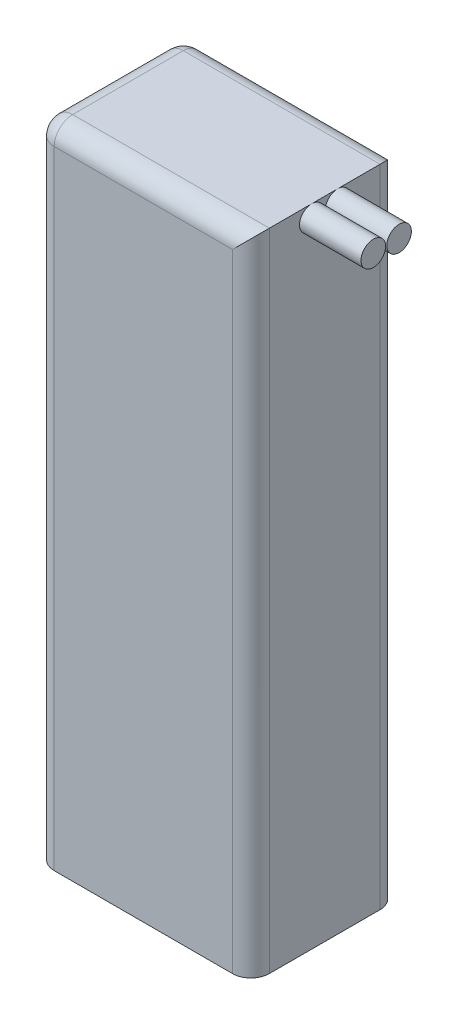
ISO-10303-21;
HEADER;
FILE_DESCRIPTION(('STEP AP214'),'2;1');
FILE_NAME('part.step','',(''),(''),'','','');
FILE_SCHEMA(('AUTOMOTIVE_DESIGN { 1 0 10303 214 1 1 1 1 }'));
ENDSEC;
DATA;
#1=APPLICATION_CONTEXT('core data for automotive mechanical design processes');
#2=APPLICATION_PROTOCOL_DEFINITION('international standard','automotive_design',2000,#1);
#3=PRODUCT_CONTEXT('',#1,'mechanical');
#4=PRODUCT('Part','Part','',(#3));
#5=PRODUCT_RELATED_PRODUCT_CATEGORY('part','',(#4));
#6=PRODUCT_DEFINITION_FORMATION('','',#4);
#7=PRODUCT_DEFINITION_CONTEXT('part definition',#1,'design');
#8=PRODUCT_DEFINITION('design','',#6,#7);
#9=PRODUCT_DEFINITION_SHAPE('','',#8);
#10=(LENGTH_UNIT() NAMED_UNIT(*) SI_UNIT(.MILLI.,.METRE.));
#11=(NAMED_UNIT(*) PLANE_ANGLE_UNIT() SI_UNIT($,.RADIAN.));
#12=(NAMED_UNIT(*) SI_UNIT($,.STERADIAN.) SOLID_ANGLE_UNIT());
#13=UNCERTAINTY_MEASURE_WITH_UNIT(LENGTH_MEASURE(1.E-05),#10,'distance_accuracy_value','');
#14=(GEOMETRIC_REPRESENTATION_CONTEXT(3) GLOBAL_UNCERTAINTY_ASSIGNED_CONTEXT((#13)) GLOBAL_UNIT_ASSIGNED_CONTEXT((#10,
#11,#12)) REPRESENTATION_CONTEXT('',''));
#15=CARTESIAN_POINT('',(0.,0.,0.));
#16=DIRECTION('',(0.,0.,1.));
#17=DIRECTION('',(1.,0.,0.));
#18=AXIS2_PLACEMENT_3D('',#15,#16,#17);
#19=CARTESIAN_POINT('',(0.,105.,0.));
#20=DIRECTION('',(1.,0.,0.));
#21=DIRECTION('',(0.,0.,-1.));
#22=AXIS2_PLACEMENT_3D('',#19,#20,#21);
#23=PLANE('',#22);
#24=DIRECTION('',(0.,0.,1.));
#25=VECTOR('',#24,1.);
#26=CARTESIAN_POINT('',(0.,102.,0.));
#27=LINE('',#26,#25);
#28=CARTESIAN_POINT('',(0.,102.,-3.));
#29=VERTEX_POINT('',#28);
#30=CARTESIAN_POINT('',(0.,102.,-21.));
#31=VERTEX_POINT('',#30);
#32=EDGE_CURVE('E161',#29,#31,#27,.F.);
#33=ORIENTED_EDGE('',*,*,#32,.T.);
#34=DIRECTION('',(0.,-1.,0.));
#35=VECTOR('',#34,1.);
#36=CARTESIAN_POINT('',(0.,105.,-21.));
#37=LINE('',#36,#35);
#38=CARTESIAN_POINT('',(0.,0.,-21.));
#39=VERTEX_POINT('',#38);
#40=EDGE_CURVE('E163',#31,#39,#37,.T.);
#41=ORIENTED_EDGE('',*,*,#40,.T.);
#42=DIRECTION('',(0.,0.,1.));
#43=VECTOR('',#42,1.);
#44=CARTESIAN_POINT('',(0.,0.,0.));
#45=LINE('',#44,#43);
#46=CARTESIAN_POINT('',(0.,0.,-3.));
#47=VERTEX_POINT('',#46);
#48=EDGE_CURVE('E217',#39,#47,#45,.T.);
#49=ORIENTED_EDGE('',*,*,#48,.T.);
#50=DIRECTION('',(0.,-1.,0.));
#51=VECTOR('',#50,1.);
#52=CARTESIAN_POINT('',(0.,105.,-3.));
#53=LINE('',#52,#51);
#54=EDGE_CURVE('E159',#47,#29,#53,.F.);
#55=ORIENTED_EDGE('',*,*,#54,.T.);
#56=EDGE_LOOP('',(#33,#41,#49,#55));
#57=FACE_BOUND('',#56,.T.);
#58=ADVANCED_FACE('F49',(#57),#23,.F.);
#59=CARTESIAN_POINT('',(0.,105.,0.));
#60=DIRECTION('',(0.,0.,-1.));
#61=DIRECTION('',(-1.,0.,0.));
#62=AXIS2_PLACEMENT_3D('',#59,#60,#61);
#63=PLANE('',#62);
#64=DIRECTION('',(1.,0.,0.));
#65=VECTOR('',#64,1.);
#66=CARTESIAN_POINT('',(0.,102.,0.));
#67=LINE('',#66,#65);
#68=CARTESIAN_POINT('',(32.,102.,0.));
#69=VERTEX_POINT('',#68);
#70=CARTESIAN_POINT('',(3.,102.,0.));
#71=VERTEX_POINT('',#70);
#72=EDGE_CURVE('E65',#69,#71,#67,.F.);
#73=ORIENTED_EDGE('',*,*,#72,.T.);
#74=DIRECTION('',(0.,-1.,0.));
#75=VECTOR('',#74,1.);
#76=CARTESIAN_POINT('',(3.,105.,0.));
#77=LINE('',#76,#75);
#78=CARTESIAN_POINT('',(3.,0.,0.));
#79=VERTEX_POINT('',#78);
#80=EDGE_CURVE('E11',#71,#79,#77,.T.);
#81=ORIENTED_EDGE('',*,*,#80,.T.);
#82=DIRECTION('',(1.,0.,0.));
#83=VECTOR('',#82,1.);
#84=CARTESIAN_POINT('',(0.,0.,0.));
#85=LINE('',#84,#83);
#86=CARTESIAN_POINT('',(32.,0.,0.));
#87=VERTEX_POINT('',#86);
#88=EDGE_CURVE('E230',#79,#87,#85,.T.);
#89=ORIENTED_EDGE('',*,*,#88,.T.);
#90=DIRECTION('',(0.,-1.,0.));
#91=VECTOR('',#90,1.);
#92=CARTESIAN_POINT('',(32.,105.,0.));
#93=LINE('',#92,#91);
#94=EDGE_CURVE('E58',#87,#69,#93,.F.);
#95=ORIENTED_EDGE('',*,*,#94,.T.);
#96=EDGE_LOOP('',(#73,#81,#89,#95));
#97=FACE_BOUND('',#96,.T.);
#98=ADVANCED_FACE('F232',(#97),#63,.F.);
#99=CARTESIAN_POINT('',(35.,105.,0.));
#100=DIRECTION('',(-1.,0.,0.));
#101=DIRECTION('',(0.,0.,1.));
#102=AXIS2_PLACEMENT_3D('',#99,#100,#101);
#103=PLANE('',#102);
#104=DIRECTION('',(0.,0.,-1.));
#105=VECTOR('',#104,1.);
#106=CARTESIAN_POINT('',(35.,0.,0.));
#107=LINE('',#106,#105);
#108=CARTESIAN_POINT('',(35.,0.,-3.));
#109=VERTEX_POINT('',#108);
#110=CARTESIAN_POINT('',(35.,0.,-21.));
#111=VERTEX_POINT('',#110);
#112=EDGE_CURVE('E145',#109,#111,#107,.T.);
#113=ORIENTED_EDGE('',*,*,#112,.T.);
#114=DIRECTION('',(0.,-1.,0.));
#115=VECTOR('',#114,1.);
#116=CARTESIAN_POINT('',(35.,105.,-21.));
#117=LINE('',#116,#115);
#118=CARTESIAN_POINT('',(35.,105.,-21.));
#119=VERTEX_POINT('',#118);
#120=EDGE_CURVE('E142',#111,#119,#117,.F.);
#121=ORIENTED_EDGE('',*,*,#120,.T.);
#122=DIRECTION('',(0.,0.,-1.));
#123=VECTOR('',#122,1.);
#124=CARTESIAN_POINT('',(35.,105.,0.));
#125=LINE('',#124,#123);
#126=CARTESIAN_POINT('',(35.,105.,-14.1));
#127=VERTEX_POINT('',#126);
#128=EDGE_CURVE('E129',#127,#119,#125,.T.);
#129=ORIENTED_EDGE('',*,*,#128,.F.);
#130=CARTESIAN_POINT('',(35.,103.,-14.1));
#131=DIRECTION('',(1.,0.,0.));
#132=DIRECTION('',(0.,0.,-1.));
#133=AXIS2_PLACEMENT_3D('',#130,#131,#132);
#134=CIRCLE('',#133,2.00000000000001);
#135=EDGE_CURVE('E140',#127,#127,#134,.T.);
#136=ORIENTED_EDGE('',*,*,#135,.F.);
#137=CARTESIAN_POINT('',(35.,105.,-9.9));
#138=VERTEX_POINT('',#137);
#139=EDGE_CURVE('E126',#138,#127,#125,.T.);
#140=ORIENTED_EDGE('',*,*,#139,.F.);
#141=CARTESIAN_POINT('',(35.,103.,-9.9));
#142=DIRECTION('',(1.,0.,0.));
#143=DIRECTION('',(0.,0.,-1.));
#144=AXIS2_PLACEMENT_3D('',#141,#142,#143);
#145=CIRCLE('',#144,2.);
#146=EDGE_CURVE('E212',#138,#138,#145,.T.);
#147=ORIENTED_EDGE('',*,*,#146,.F.);
#148=CARTESIAN_POINT('',(35.,105.,-3.));
#149=VERTEX_POINT('',#148);
#150=EDGE_CURVE('E132',#149,#138,#125,.T.);
#151=ORIENTED_EDGE('',*,*,#150,.F.);
#152=DIRECTION('',(0.,-1.,0.));
#153=VECTOR('',#152,1.);
#154=CARTESIAN_POINT('',(35.,105.,-3.));
#155=LINE('',#154,#153);
#156=EDGE_CURVE('E179',#149,#109,#155,.T.);
#157=ORIENTED_EDGE('',*,*,#156,.T.);
#158=EDGE_LOOP('',(#113,#121,#129,#136,#140,#147,#151,#157));
#159=FACE_BOUND('',#158,.T.);
#160=ADVANCED_FACE('F138',(#159),#103,.F.);
#161=CARTESIAN_POINT('',(0.,105.,-24.));
#162=DIRECTION('',(0.,0.,1.));
#163=DIRECTION('',(1.,0.,0.));
#164=AXIS2_PLACEMENT_3D('',#161,#162,#163);
#165=PLANE('',#164);
#166=DIRECTION('',(-1.,0.,0.));
#167=VECTOR('',#166,1.);
#168=CARTESIAN_POINT('',(0.,0.,-24.));
#169=LINE('',#168,#167);
#170=CARTESIAN_POINT('',(32.,0.,-24.));
#171=VERTEX_POINT('',#170);
#172=CARTESIAN_POINT('',(3.00000000000001,0.,-24.));
#173=VERTEX_POINT('',#172);
#174=EDGE_CURVE('E143',#171,#173,#169,.T.);
#175=ORIENTED_EDGE('',*,*,#174,.T.);
#176=DIRECTION('',(0.,-1.,0.));
#177=VECTOR('',#176,1.);
#178=CARTESIAN_POINT('',(3.00000000000001,105.,-24.));
#179=LINE('',#178,#177);
#180=CARTESIAN_POINT('',(3.00000000000001,102.,-24.));
#181=VERTEX_POINT('',#180);
#182=EDGE_CURVE('E169',#173,#181,#179,.F.);
#183=ORIENTED_EDGE('',*,*,#182,.T.);
#184=DIRECTION('',(-1.,0.,0.));
#185=VECTOR('',#184,1.);
#186=CARTESIAN_POINT('',(0.,102.,-24.));
#187=LINE('',#186,#185);
#188=CARTESIAN_POINT('',(32.,102.,-24.));
#189=VERTEX_POINT('',#188);
#190=EDGE_CURVE('E167',#181,#189,#187,.F.);
#191=ORIENTED_EDGE('',*,*,#190,.T.);
#192=DIRECTION('',(0.,-1.,0.));
#193=VECTOR('',#192,1.);
#194=CARTESIAN_POINT('',(32.,105.,-24.));
#195=LINE('',#194,#193);
#196=EDGE_CURVE('E165',#189,#171,#195,.T.);
#197=ORIENTED_EDGE('',*,*,#196,.T.);
#198=EDGE_LOOP('',(#175,#183,#191,#197));
#199=FACE_BOUND('',#198,.T.);
#200=ADVANCED_FACE('F263',(#199),#165,.F.);
#201=CARTESIAN_POINT('',(0.,105.,0.));
#202=DIRECTION('',(0.,-1.,0.));
#203=DIRECTION('',(0.,0.,-1.));
#204=AXIS2_PLACEMENT_3D('',#201,#202,#203);
#205=PLANE('',#204);
#206=ORIENTED_EDGE('',*,*,#128,.T.);
#207=DIRECTION('',(-1.,0.,0.));
#208=VECTOR('',#207,1.);
#209=CARTESIAN_POINT('',(0.,105.,-21.));
#210=LINE('',#209,#208);
#211=CARTESIAN_POINT('',(3.00000000000001,105.,-21.));
#212=VERTEX_POINT('',#211);
#213=EDGE_CURVE('E154',#119,#212,#210,.T.);
#214=ORIENTED_EDGE('',*,*,#213,.T.);
#215=DIRECTION('',(0.,0.,1.));
#216=VECTOR('',#215,1.);
#217=CARTESIAN_POINT('',(3.,105.,0.));
#218=LINE('',#217,#216);
#219=CARTESIAN_POINT('',(3.,105.,-3.));
#220=VERTEX_POINT('',#219);
#221=EDGE_CURVE('E150',#212,#220,#218,.T.);
#222=ORIENTED_EDGE('',*,*,#221,.T.);
#223=DIRECTION('',(1.,0.,0.));
#224=VECTOR('',#223,1.);
#225=CARTESIAN_POINT('',(0.,105.,-3.));
#226=LINE('',#225,#224);
#227=EDGE_CURVE('E149',#220,#149,#226,.T.);
#228=ORIENTED_EDGE('',*,*,#227,.T.);
#229=ORIENTED_EDGE('',*,*,#150,.T.);
#230=ORIENTED_EDGE('',*,*,#139,.T.);
#231=EDGE_LOOP('',(#206,#214,#222,#228,#229,#230));
#232=FACE_BOUND('',#231,.T.);
#233=ADVANCED_FACE('F128',(#232),#205,.F.);
#234=CARTESIAN_POINT('',(0.,0.,0.));
#235=DIRECTION('',(0.,-1.,0.));
#236=DIRECTION('',(0.,0.,-1.));
#237=AXIS2_PLACEMENT_3D('',#234,#235,#236);
#238=PLANE('',#237);
#239=ORIENTED_EDGE('',*,*,#48,.F.);
#240=CARTESIAN_POINT('',(3.00000000000001,0.,-21.));
#241=DIRECTION('',(0.,-1.,0.));
#242=DIRECTION('',(0.,0.,-1.));
#243=AXIS2_PLACEMENT_3D('',#240,#241,#242);
#244=CIRCLE('',#243,3.);
#245=EDGE_CURVE('E177',#39,#173,#244,.T.);
#246=ORIENTED_EDGE('',*,*,#245,.T.);
#247=ORIENTED_EDGE('',*,*,#174,.F.);
#248=CARTESIAN_POINT('',(32.,0.,-21.));
#249=DIRECTION('',(0.,-1.,0.));
#250=DIRECTION('',(0.,0.,-1.));
#251=AXIS2_PLACEMENT_3D('',#248,#249,#250);
#252=CIRCLE('',#251,3.);
#253=EDGE_CURVE('E175',#171,#111,#252,.T.);
#254=ORIENTED_EDGE('',*,*,#253,.T.);
#255=ORIENTED_EDGE('',*,*,#112,.F.);
#256=CARTESIAN_POINT('',(32.,0.,-3.));
#257=DIRECTION('',(0.,-1.,0.));
#258=DIRECTION('',(0.,0.,-1.));
#259=AXIS2_PLACEMENT_3D('',#256,#257,#258);
#260=CIRCLE('',#259,3.);
#261=EDGE_CURVE('E171',#109,#87,#260,.T.);
#262=ORIENTED_EDGE('',*,*,#261,.T.);
#263=ORIENTED_EDGE('',*,*,#88,.F.);
#264=CARTESIAN_POINT('',(3.,0.,-3.));
#265=DIRECTION('',(0.,-1.,0.));
#266=DIRECTION('',(0.,0.,-1.));
#267=AXIS2_PLACEMENT_3D('',#264,#265,#266);
#268=CIRCLE('',#267,3.);
#269=EDGE_CURVE('E173',#79,#47,#268,.T.);
#270=ORIENTED_EDGE('',*,*,#269,.T.);
#271=EDGE_LOOP('',(#239,#246,#247,#254,#255,#262,#263,#270));
#272=FACE_BOUND('',#271,.T.);
#273=ADVANCED_FACE('F229',(#272),#238,.T.);
#274=CARTESIAN_POINT('',(45.,103.,-9.90000000000001));
#275=DIRECTION('',(-1.,0.,0.));
#276=DIRECTION('',(0.,0.,1.));
#277=AXIS2_PLACEMENT_3D('',#274,#275,#276);
#278=CYLINDRICAL_SURFACE('',#277,2.);
#279=CARTESIAN_POINT('',(45.,103.,-9.90000000000001));
#280=DIRECTION('',(1.,0.,0.));
#281=DIRECTION('',(0.,0.,-1.));
#282=AXIS2_PLACEMENT_3D('',#279,#280,#281);
#283=CIRCLE('',#282,2.);
#284=CARTESIAN_POINT('',(45.,103.,-11.9));
#285=VERTEX_POINT('',#284);
#286=EDGE_CURVE('E215',#285,#285,#283,.T.);
#287=ORIENTED_EDGE('',*,*,#286,.F.);
#288=EDGE_LOOP('',(#287));
#289=FACE_BOUND('',#288,.T.);
#290=ORIENTED_EDGE('',*,*,#146,.T.);
#291=EDGE_LOOP('',(#290));
#292=FACE_BOUND('',#291,.T.);
#293=ADVANCED_FACE('F220',(#289,#292),#278,.T.);
#294=CARTESIAN_POINT('',(45.,103.,-9.90000000000001));
#295=DIRECTION('',(1.,0.,0.));
#296=DIRECTION('',(0.,0.,-1.));
#297=AXIS2_PLACEMENT_3D('',#294,#295,#296);
#298=PLANE('',#297);
#299=ORIENTED_EDGE('',*,*,#286,.T.);
#300=EDGE_LOOP('',(#299));
#301=FACE_BOUND('',#300,.T.);
#302=ADVANCED_FACE('F359',(#301),#298,.T.);
#303=CARTESIAN_POINT('',(45.,103.,-14.1));
#304=DIRECTION('',(-1.,0.,0.));
#305=DIRECTION('',(0.,0.,1.));
#306=AXIS2_PLACEMENT_3D('',#303,#304,#305);
#307=CYLINDRICAL_SURFACE('',#306,2.00000000000001);
#308=CARTESIAN_POINT('',(45.,103.,-14.1));
#309=DIRECTION('',(1.,0.,0.));
#310=DIRECTION('',(0.,0.,-1.));
#311=AXIS2_PLACEMENT_3D('',#308,#309,#310);
#312=CIRCLE('',#311,2.00000000000001);
#313=CARTESIAN_POINT('',(45.,103.,-16.1));
#314=VERTEX_POINT('',#313);
#315=EDGE_CURVE('E204',#314,#314,#312,.T.);
#316=ORIENTED_EDGE('',*,*,#315,.F.);
#317=EDGE_LOOP('',(#316));
#318=FACE_BOUND('',#317,.T.);
#319=ORIENTED_EDGE('',*,*,#135,.T.);
#320=EDGE_LOOP('',(#319));
#321=FACE_BOUND('',#320,.T.);
#322=ADVANCED_FACE('F273',(#318,#321),#307,.T.);
#323=CARTESIAN_POINT('',(45.,103.,-14.1));
#324=DIRECTION('',(1.,0.,0.));
#325=DIRECTION('',(0.,0.,-1.));
#326=AXIS2_PLACEMENT_3D('',#323,#324,#325);
#327=PLANE('',#326);
#328=ORIENTED_EDGE('',*,*,#315,.T.);
#329=EDGE_LOOP('',(#328));
#330=FACE_BOUND('',#329,.T.);
#331=ADVANCED_FACE('F267',(#330),#327,.T.);
#332=CARTESIAN_POINT('',(32.,105.,-21.));
#333=DIRECTION('',(0.,-1.,0.));
#334=DIRECTION('',(0.,0.,-1.));
#335=AXIS2_PLACEMENT_3D('',#332,#333,#334);
#336=CYLINDRICAL_SURFACE('',#335,3.);
#337=ORIENTED_EDGE('',*,*,#253,.F.);
#338=ORIENTED_EDGE('',*,*,#196,.F.);
#339=CARTESIAN_POINT('',(32.,102.,-21.));
#340=DIRECTION('',(0.707106781186547,-0.707106781186547,0.));
#341=DIRECTION('',(-0.707106781186547,-0.707106781186547,0.));
#342=AXIS2_PLACEMENT_3D('',#339,#340,#341);
#343=ELLIPSE('',#342,4.24264068711928,3.);
#344=EDGE_CURVE('E53',#119,#189,#343,.F.);
#345=ORIENTED_EDGE('',*,*,#344,.F.);
#346=ORIENTED_EDGE('',*,*,#120,.F.);
#347=EDGE_LOOP('',(#337,#338,#345,#346));
#348=FACE_BOUND('',#347,.T.);
#349=ADVANCED_FACE('F51',(#348),#336,.T.);
#350=CARTESIAN_POINT('',(32.,105.,-3.));
#351=DIRECTION('',(0.,-1.,0.));
#352=DIRECTION('',(0.,0.,-1.));
#353=AXIS2_PLACEMENT_3D('',#350,#351,#352);
#354=CYLINDRICAL_SURFACE('',#353,3.);
#355=ORIENTED_EDGE('',*,*,#261,.F.);
#356=ORIENTED_EDGE('',*,*,#156,.F.);
#357=CARTESIAN_POINT('',(32.,102.,-3.));
#358=DIRECTION('',(0.707106781186547,-0.707106781186547,0.));
#359=DIRECTION('',(0.707106781186547,0.707106781186547,0.));
#360=AXIS2_PLACEMENT_3D('',#357,#358,#359);
#361=ELLIPSE('',#360,4.24264068711928,3.);
#362=EDGE_CURVE('E200',#69,#149,#361,.F.);
#363=ORIENTED_EDGE('',*,*,#362,.F.);
#364=ORIENTED_EDGE('',*,*,#94,.F.);
#365=EDGE_LOOP('',(#355,#356,#363,#364));
#366=FACE_BOUND('',#365,.T.);
#367=ADVANCED_FACE('F225',(#366),#354,.T.);
#368=CARTESIAN_POINT('',(3.00000000000001,105.,-21.));
#369=DIRECTION('',(0.,-1.,0.));
#370=DIRECTION('',(0.,0.,-1.));
#371=AXIS2_PLACEMENT_3D('',#368,#369,#370);
#372=CYLINDRICAL_SURFACE('',#371,3.);
#373=ORIENTED_EDGE('',*,*,#245,.F.);
#374=ORIENTED_EDGE('',*,*,#40,.F.);
#375=CARTESIAN_POINT('',(3.00000000000001,102.,-21.));
#376=DIRECTION('',(0.,1.,0.));
#377=DIRECTION('',(0.,0.,1.));
#378=AXIS2_PLACEMENT_3D('',#375,#376,#377);
#379=CIRCLE('',#378,3.);
#380=EDGE_CURVE('E198',#181,#31,#379,.T.);
#381=ORIENTED_EDGE('',*,*,#380,.F.);
#382=ORIENTED_EDGE('',*,*,#182,.F.);
#383=EDGE_LOOP('',(#373,#374,#381,#382));
#384=FACE_BOUND('',#383,.T.);
#385=ADVANCED_FACE('F259',(#384),#372,.T.);
#386=CARTESIAN_POINT('',(0.,102.,-21.));
#387=DIRECTION('',(-1.,0.,0.));
#388=DIRECTION('',(0.,0.,1.));
#389=AXIS2_PLACEMENT_3D('',#386,#387,#388);
#390=CYLINDRICAL_SURFACE('',#389,3.);
#391=ORIENTED_EDGE('',*,*,#344,.T.);
#392=ORIENTED_EDGE('',*,*,#190,.F.);
#393=CARTESIAN_POINT('',(3.00000000000001,102.,-21.));
#394=DIRECTION('',(-1.,0.,0.));
#395=DIRECTION('',(0.,0.,1.));
#396=AXIS2_PLACEMENT_3D('',#393,#394,#395);
#397=CIRCLE('',#396,3.);
#398=EDGE_CURVE('E195',#212,#181,#397,.T.);
#399=ORIENTED_EDGE('',*,*,#398,.F.);
#400=ORIENTED_EDGE('',*,*,#213,.F.);
#401=EDGE_LOOP('',(#391,#392,#399,#400));
#402=FACE_BOUND('',#401,.T.);
#403=ADVANCED_FACE('F253',(#402),#390,.T.);
#404=CARTESIAN_POINT('',(0.,102.,-3.));
#405=DIRECTION('',(1.,0.,0.));
#406=DIRECTION('',(0.,0.,-1.));
#407=AXIS2_PLACEMENT_3D('',#404,#405,#406);
#408=CYLINDRICAL_SURFACE('',#407,3.);
#409=ORIENTED_EDGE('',*,*,#362,.T.);
#410=ORIENTED_EDGE('',*,*,#227,.F.);
#411=CARTESIAN_POINT('',(3.,102.,-3.));
#412=DIRECTION('',(-1.,0.,0.));
#413=DIRECTION('',(0.,0.,1.));
#414=AXIS2_PLACEMENT_3D('',#411,#412,#413);
#415=CIRCLE('',#414,3.);
#416=EDGE_CURVE('E192',#71,#220,#415,.T.);
#417=ORIENTED_EDGE('',*,*,#416,.F.);
#418=ORIENTED_EDGE('',*,*,#72,.F.);
#419=EDGE_LOOP('',(#409,#410,#417,#418));
#420=FACE_BOUND('',#419,.T.);
#421=ADVANCED_FACE('F251',(#420),#408,.T.);
#422=CARTESIAN_POINT('',(3.,105.,-3.));
#423=DIRECTION('',(0.,-1.,0.));
#424=DIRECTION('',(0.,0.,-1.));
#425=AXIS2_PLACEMENT_3D('',#422,#423,#424);
#426=CYLINDRICAL_SURFACE('',#425,3.);
#427=ORIENTED_EDGE('',*,*,#269,.F.);
#428=ORIENTED_EDGE('',*,*,#80,.F.);
#429=CARTESIAN_POINT('',(3.,102.,-3.));
#430=DIRECTION('',(0.,1.,0.));
#431=DIRECTION('',(0.,0.,1.));
#432=AXIS2_PLACEMENT_3D('',#429,#430,#431);
#433=CIRCLE('',#432,3.);
#434=EDGE_CURVE('E189',#29,#71,#433,.T.);
#435=ORIENTED_EDGE('',*,*,#434,.F.);
#436=ORIENTED_EDGE('',*,*,#54,.F.);
#437=EDGE_LOOP('',(#427,#428,#435,#436));
#438=FACE_BOUND('',#437,.T.);
#439=ADVANCED_FACE('F241',(#438),#426,.T.);
#440=CARTESIAN_POINT('',(3.00000000000001,102.,-21.));
#441=DIRECTION('',(0.,0.,-1.));
#442=DIRECTION('',(-1.,0.,0.));
#443=AXIS2_PLACEMENT_3D('',#440,#441,#442);
#444=SPHERICAL_SURFACE('',#443,3.);
#445=ORIENTED_EDGE('',*,*,#398,.T.);
#446=ORIENTED_EDGE('',*,*,#380,.T.);
#447=CARTESIAN_POINT('',(3.00000000000001,102.,-21.));
#448=DIRECTION('',(0.,0.,-1.));
#449=DIRECTION('',(-1.,0.,0.));
#450=AXIS2_PLACEMENT_3D('',#447,#448,#449);
#451=CIRCLE('',#450,3.);
#452=EDGE_CURVE('E186',#212,#31,#451,.F.);
#453=ORIENTED_EDGE('',*,*,#452,.F.);
#454=EDGE_LOOP('',(#445,#446,#453));
#455=FACE_BOUND('',#454,.T.);
#456=ADVANCED_FACE('F256',(#455),#444,.T.);
#457=CARTESIAN_POINT('',(3.,102.,-3.));
#458=DIRECTION('',(0.,0.,1.));
#459=DIRECTION('',(1.,0.,0.));
#460=AXIS2_PLACEMENT_3D('',#457,#458,#459);
#461=SPHERICAL_SURFACE('',#460,3.);
#462=ORIENTED_EDGE('',*,*,#434,.T.);
#463=ORIENTED_EDGE('',*,*,#416,.T.);
#464=CARTESIAN_POINT('',(3.,102.,-3.));
#465=DIRECTION('',(0.,0.,1.));
#466=DIRECTION('',(1.,0.,0.));
#467=AXIS2_PLACEMENT_3D('',#464,#465,#466);
#468=CIRCLE('',#467,3.);
#469=EDGE_CURVE('E184',#29,#220,#468,.F.);
#470=ORIENTED_EDGE('',*,*,#469,.F.);
#471=EDGE_LOOP('',(#462,#463,#470));
#472=FACE_BOUND('',#471,.T.);
#473=ADVANCED_FACE('F250',(#472),#461,.T.);
#474=CARTESIAN_POINT('',(3.,102.,0.));
#475=DIRECTION('',(0.,0.,1.));
#476=DIRECTION('',(1.,0.,0.));
#477=AXIS2_PLACEMENT_3D('',#474,#475,#476);
#478=CYLINDRICAL_SURFACE('',#477,3.);
#479=ORIENTED_EDGE('',*,*,#452,.T.);
#480=ORIENTED_EDGE('',*,*,#32,.F.);
#481=ORIENTED_EDGE('',*,*,#469,.T.);
#482=ORIENTED_EDGE('',*,*,#221,.F.);
#483=EDGE_LOOP('',(#479,#480,#481,#482));
#484=FACE_BOUND('',#483,.T.);
#485=ADVANCED_FACE('F247',(#484),#478,.T.);
#486=CLOSED_SHELL('',(#58,#98,#160,#200,#233,#273,#293,#302,#322,#331,#349,#367,#385,#403,#421,
#439,#456,#473,#485));
#487=MANIFOLD_SOLID_BREP('B2',#486);
#488=ADVANCED_BREP_SHAPE_REPRESENTATION('',(#18,#487),#14);
#489=SHAPE_DEFINITION_REPRESENTATION(#9,#488);
ENDSEC;
END-ISO-10303-21;
